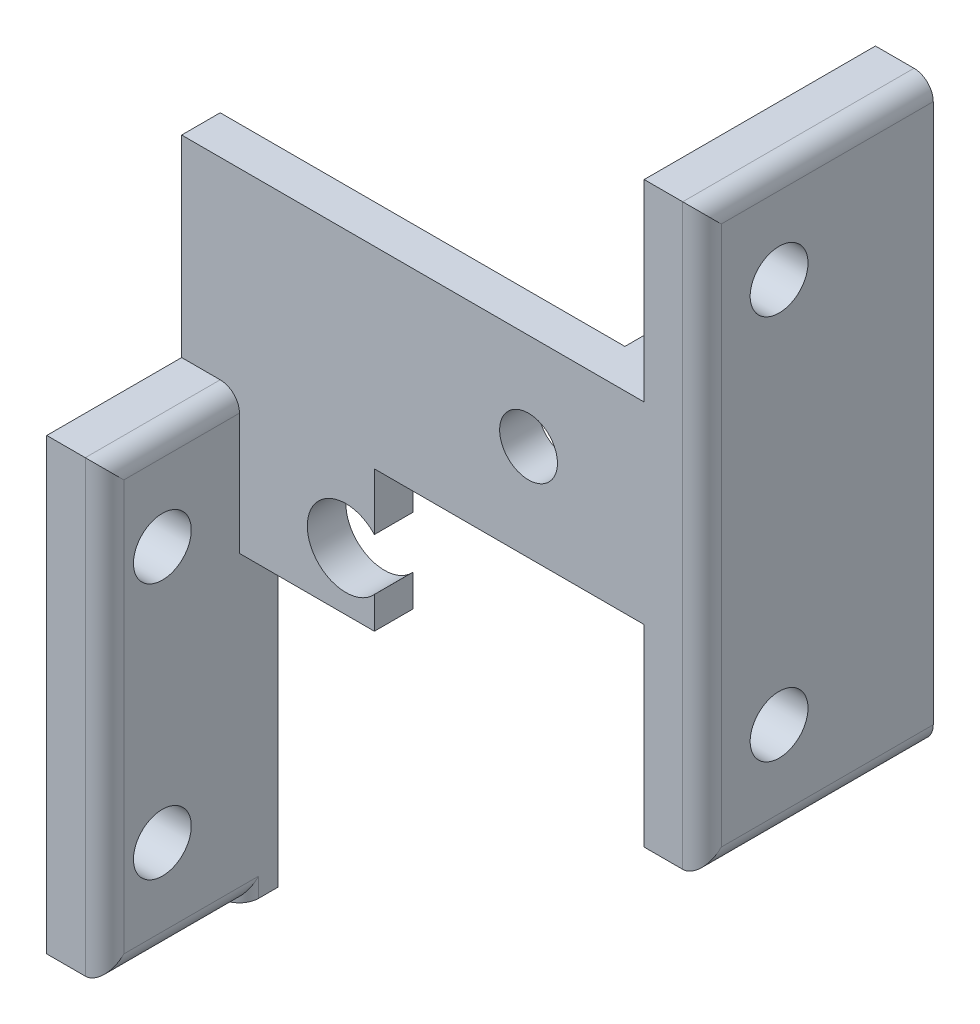
ISO-10303-21;
HEADER;
FILE_DESCRIPTION(('STEP AP214'),'2;1');
FILE_NAME('part.step','',(''),(''),'','','');
FILE_SCHEMA(('AUTOMOTIVE_DESIGN { 1 0 10303 214 1 1 1 1 }'));
ENDSEC;
DATA;
#1=APPLICATION_CONTEXT('core data for automotive mechanical design processes');
#2=APPLICATION_PROTOCOL_DEFINITION('international standard','automotive_design',2000,#1);
#3=PRODUCT_CONTEXT('',#1,'mechanical');
#4=PRODUCT('Part','Part','',(#3));
#5=PRODUCT_RELATED_PRODUCT_CATEGORY('part','',(#4));
#6=PRODUCT_DEFINITION_FORMATION('','',#4);
#7=PRODUCT_DEFINITION_CONTEXT('part definition',#1,'design');
#8=PRODUCT_DEFINITION('design','',#6,#7);
#9=PRODUCT_DEFINITION_SHAPE('','',#8);
#10=(LENGTH_UNIT() NAMED_UNIT(*) SI_UNIT(.MILLI.,.METRE.));
#11=(NAMED_UNIT(*) PLANE_ANGLE_UNIT() SI_UNIT($,.RADIAN.));
#12=(NAMED_UNIT(*) SI_UNIT($,.STERADIAN.) SOLID_ANGLE_UNIT());
#13=UNCERTAINTY_MEASURE_WITH_UNIT(LENGTH_MEASURE(1.E-05),#10,'distance_accuracy_value','');
#14=(GEOMETRIC_REPRESENTATION_CONTEXT(3) GLOBAL_UNCERTAINTY_ASSIGNED_CONTEXT((#13)) GLOBAL_UNIT_ASSIGNED_CONTEXT((#10,
#11,#12)) REPRESENTATION_CONTEXT('',''));
#15=CARTESIAN_POINT('',(0.,0.,0.));
#16=DIRECTION('',(0.,0.,1.));
#17=DIRECTION('',(1.,0.,0.));
#18=AXIS2_PLACEMENT_3D('',#15,#16,#17);
#19=CARTESIAN_POINT('',(7.,0.,0.));
#20=DIRECTION('',(1.,0.,0.));
#21=DIRECTION('',(0.,0.,-1.));
#22=AXIS2_PLACEMENT_3D('',#19,#20,#21);
#23=PLANE('',#22);
#24=DIRECTION('',(0.,0.,1.));
#25=VECTOR('',#24,1.);
#26=CARTESIAN_POINT('',(7.,-12.954786262336,14.));
#27=LINE('',#26,#25);
#28=CARTESIAN_POINT('',(7.,-12.954786262336,22.));
#29=VERTEX_POINT('',#28);
#30=CARTESIAN_POINT('',(7.,-12.954786262336,24.));
#31=VERTEX_POINT('',#30);
#32=EDGE_CURVE('E450',#29,#31,#27,.T.);
#33=ORIENTED_EDGE('',*,*,#32,.F.);
#34=DIRECTION('',(0.,1.,0.));
#35=VECTOR('',#34,1.);
#36=CARTESIAN_POINT('',(7.,-33.3,22.));
#37=LINE('',#36,#35);
#38=CARTESIAN_POINT('',(7.,-10.,22.));
#39=VERTEX_POINT('',#38);
#40=EDGE_CURVE('E340',#29,#39,#37,.T.);
#41=ORIENTED_EDGE('',*,*,#40,.T.);
#42=DIRECTION('',(0.,0.,-1.));
#43=VECTOR('',#42,1.);
#44=CARTESIAN_POINT('',(7.,-10.,0.));
#45=LINE('',#44,#43);
#46=CARTESIAN_POINT('',(7.,-10.,24.));
#47=VERTEX_POINT('',#46);
#48=EDGE_CURVE('E345',#47,#39,#45,.T.);
#49=ORIENTED_EDGE('',*,*,#48,.F.);
#50=DIRECTION('',(0.,-1.,0.));
#51=VECTOR('',#50,1.);
#52=CARTESIAN_POINT('',(7.,0.,24.));
#53=LINE('',#52,#51);
#54=EDGE_CURVE('E249',#47,#31,#53,.T.);
#55=ORIENTED_EDGE('',*,*,#54,.T.);
#56=EDGE_LOOP('',(#33,#41,#49,#55));
#57=FACE_BOUND('',#56,.T.);
#58=ADVANCED_FACE('F35',(#57),#23,.T.);
#59=DIRECTION('',(0.,0.,1.));
#60=VECTOR('',#59,1.);
#61=CARTESIAN_POINT('',(7.,-15.645213737664,14.));
#62=LINE('',#61,#60);
#63=CARTESIAN_POINT('',(7.,-15.645213737664,24.));
#64=VERTEX_POINT('',#63);
#65=CARTESIAN_POINT('',(7.,-15.645213737664,22.));
#66=VERTEX_POINT('',#65);
#67=EDGE_CURVE('E57',#64,#66,#62,.F.);
#68=ORIENTED_EDGE('',*,*,#67,.F.);
#69=CARTESIAN_POINT('',(7.,-17.3,24.));
#70=VERTEX_POINT('',#69);
#71=EDGE_CURVE('E243',#64,#70,#53,.T.);
#72=ORIENTED_EDGE('',*,*,#71,.T.);
#73=DIRECTION('',(0.,0.,1.));
#74=VECTOR('',#73,1.);
#75=CARTESIAN_POINT('',(7.,-17.3,22.));
#76=LINE('',#75,#74);
#77=CARTESIAN_POINT('',(7.,-17.3,22.));
#78=VERTEX_POINT('',#77);
#79=EDGE_CURVE('E267',#78,#70,#76,.T.);
#80=ORIENTED_EDGE('',*,*,#79,.F.);
#81=EDGE_CURVE('E244',#78,#66,#37,.T.);
#82=ORIENTED_EDGE('',*,*,#81,.T.);
#83=EDGE_LOOP('',(#68,#72,#80,#82));
#84=FACE_BOUND('',#83,.T.);
#85=ADVANCED_FACE('F265',(#84),#23,.T.);
#86=CARTESIAN_POINT('',(7.,0.,24.));
#87=DIRECTION('',(0.,0.,-1.));
#88=DIRECTION('',(0.,1.,0.));
#89=AXIS2_PLACEMENT_3D('',#86,#87,#88);
#90=PLANE('',#89);
#91=ORIENTED_EDGE('',*,*,#71,.F.);
#92=CARTESIAN_POINT('',(5.52,-14.3,24.));
#93=DIRECTION('',(0.,0.,1.));
#94=DIRECTION('',(1.,0.,0.));
#95=AXIS2_PLACEMENT_3D('',#92,#93,#94);
#96=CIRCLE('',#95,2.);
#97=EDGE_CURVE('E196',#31,#64,#96,.T.);
#98=ORIENTED_EDGE('',*,*,#97,.F.);
#99=ORIENTED_EDGE('',*,*,#54,.F.);
#100=DIRECTION('',(1.,0.,0.));
#101=VECTOR('',#100,1.);
#102=CARTESIAN_POINT('',(0.,-10.,24.));
#103=LINE('',#102,#101);
#104=CARTESIAN_POINT('',(21.,-10.,24.));
#105=VERTEX_POINT('',#104);
#106=EDGE_CURVE('E234',#47,#105,#103,.T.);
#107=ORIENTED_EDGE('',*,*,#106,.T.);
#108=DIRECTION('',(0.,-1.,0.));
#109=VECTOR('',#108,1.);
#110=CARTESIAN_POINT('',(21.,0.,24.));
#111=LINE('',#110,#109);
#112=CARTESIAN_POINT('',(21.,-20.,24.));
#113=VERTEX_POINT('',#112);
#114=EDGE_CURVE('E402',#105,#113,#111,.T.);
#115=ORIENTED_EDGE('',*,*,#114,.T.);
#116=DIRECTION('',(-1.,0.,0.));
#117=VECTOR('',#116,1.);
#118=CARTESIAN_POINT('',(24.,-20.,24.));
#119=LINE('',#118,#117);
#120=CARTESIAN_POINT('',(23.,-20.,24.));
#121=VERTEX_POINT('',#120);
#122=EDGE_CURVE('E421',#121,#113,#119,.T.);
#123=ORIENTED_EDGE('',*,*,#122,.F.);
#124=DIRECTION('',(0.,-1.,0.));
#125=VECTOR('',#124,1.);
#126=CARTESIAN_POINT('',(23.,10.,24.));
#127=LINE('',#126,#125);
#128=CARTESIAN_POINT('',(23.,10.,24.));
#129=VERTEX_POINT('',#128);
#130=EDGE_CURVE('E317',#121,#129,#127,.F.);
#131=ORIENTED_EDGE('',*,*,#130,.T.);
#132=DIRECTION('',(-1.,0.,0.));
#133=VECTOR('',#132,1.);
#134=CARTESIAN_POINT('',(24.,10.,24.));
#135=LINE('',#134,#133);
#136=CARTESIAN_POINT('',(21.,10.,24.));
#137=VERTEX_POINT('',#136);
#138=EDGE_CURVE('E397',#129,#137,#135,.T.);
#139=ORIENTED_EDGE('',*,*,#138,.T.);
#140=CARTESIAN_POINT('',(21.,0.,24.));
#141=VERTEX_POINT('',#140);
#142=EDGE_CURVE('E395',#137,#141,#111,.T.);
#143=ORIENTED_EDGE('',*,*,#142,.T.);
#144=DIRECTION('',(-1.,0.,0.));
#145=VECTOR('',#144,1.);
#146=CARTESIAN_POINT('',(7.,0.,24.));
#147=LINE('',#146,#145);
#148=CARTESIAN_POINT('',(-3.,0.,24.));
#149=VERTEX_POINT('',#148);
#150=EDGE_CURVE('E251',#141,#149,#147,.T.);
#151=ORIENTED_EDGE('',*,*,#150,.T.);
#152=DIRECTION('',(0.,1.,0.));
#153=VECTOR('',#152,1.);
#154=CARTESIAN_POINT('',(-3.,0.,24.));
#155=LINE('',#154,#153);
#156=CARTESIAN_POINT('',(-3.,-10.,24.));
#157=VERTEX_POINT('',#156);
#158=EDGE_CURVE('E393',#157,#149,#155,.T.);
#159=ORIENTED_EDGE('',*,*,#158,.F.);
#160=DIRECTION('',(1.,0.,0.));
#161=VECTOR('',#160,1.);
#162=CARTESIAN_POINT('',(-3.,-10.,24.));
#163=LINE('',#162,#161);
#164=CARTESIAN_POINT('',(-1.,-10.,24.));
#165=VERTEX_POINT('',#164);
#166=EDGE_CURVE('E277',#157,#165,#163,.T.);
#167=ORIENTED_EDGE('',*,*,#166,.T.);
#168=CARTESIAN_POINT('',(-1.,-11.,24.));
#169=DIRECTION('',(0.,0.,-1.));
#170=DIRECTION('',(0.,1.,0.));
#171=AXIS2_PLACEMENT_3D('',#168,#169,#170);
#172=CIRCLE('',#171,1.);
#173=CARTESIAN_POINT('',(0.,-11.,24.));
#174=VERTEX_POINT('',#173);
#175=EDGE_CURVE('E292',#165,#174,#172,.T.);
#176=ORIENTED_EDGE('',*,*,#175,.T.);
#177=DIRECTION('',(0.,-1.,0.));
#178=VECTOR('',#177,1.);
#179=CARTESIAN_POINT('',(0.,0.,24.));
#180=LINE('',#179,#178);
#181=CARTESIAN_POINT('',(0.,-17.3,24.));
#182=VERTEX_POINT('',#181);
#183=EDGE_CURVE('E240',#174,#182,#180,.T.);
#184=ORIENTED_EDGE('',*,*,#183,.T.);
#185=DIRECTION('',(-1.,0.,0.));
#186=VECTOR('',#185,1.);
#187=CARTESIAN_POINT('',(7.,-17.3,24.));
#188=LINE('',#187,#186);
#189=EDGE_CURVE('E273',#70,#182,#188,.T.);
#190=ORIENTED_EDGE('',*,*,#189,.F.);
#191=EDGE_LOOP('',(#91,#98,#99,#107,#115,#123,#131,#139,#143,#151,#159,#167,#176,#184,#190));
#192=FACE_BOUND('',#191,.T.);
#193=CARTESIAN_POINT('',(15.,-5.,24.));
#194=DIRECTION('',(0.,0.,1.));
#195=DIRECTION('',(1.,0.,0.));
#196=AXIS2_PLACEMENT_3D('',#193,#194,#195);
#197=CIRCLE('',#196,1.5);
#198=CARTESIAN_POINT('',(16.5,-5.,24.));
#199=VERTEX_POINT('',#198);
#200=EDGE_CURVE('E353',#199,#199,#197,.T.);
#201=ORIENTED_EDGE('',*,*,#200,.F.);
#202=EDGE_LOOP('',(#201));
#203=FACE_BOUND('',#202,.T.);
#204=ADVANCED_FACE('F274',(#192,#203),#90,.F.);
#205=CARTESIAN_POINT('',(7.,0.,24.));
#206=DIRECTION('',(0.,-1.,0.));
#207=DIRECTION('',(0.,0.,-1.));
#208=AXIS2_PLACEMENT_3D('',#205,#206,#207);
#209=PLANE('',#208);
#210=DIRECTION('',(0.,0.,1.));
#211=VECTOR('',#210,1.);
#212=CARTESIAN_POINT('',(21.,0.,24.));
#213=LINE('',#212,#211);
#214=CARTESIAN_POINT('',(21.,0.,12.));
#215=VERTEX_POINT('',#214);
#216=EDGE_CURVE('E231',#215,#141,#213,.T.);
#217=ORIENTED_EDGE('',*,*,#216,.F.);
#218=DIRECTION('',(-1.,0.,0.));
#219=VECTOR('',#218,1.);
#220=CARTESIAN_POINT('',(7.,0.,12.));
#221=LINE('',#220,#219);
#222=CARTESIAN_POINT('',(18.,0.,12.));
#223=VERTEX_POINT('',#222);
#224=EDGE_CURVE('E383',#215,#223,#221,.T.);
#225=ORIENTED_EDGE('',*,*,#224,.T.);
#226=DIRECTION('',(0.,0.,1.));
#227=VECTOR('',#226,1.);
#228=CARTESIAN_POINT('',(18.,0.,24.));
#229=LINE('',#228,#227);
#230=CARTESIAN_POINT('',(18.,0.,22.));
#231=VERTEX_POINT('',#230);
#232=EDGE_CURVE('E217',#223,#231,#229,.T.);
#233=ORIENTED_EDGE('',*,*,#232,.T.);
#234=DIRECTION('',(1.,0.,0.));
#235=VECTOR('',#234,1.);
#236=CARTESIAN_POINT('',(7.,0.,22.));
#237=LINE('',#236,#235);
#238=CARTESIAN_POINT('',(-3.,0.,22.));
#239=VERTEX_POINT('',#238);
#240=EDGE_CURVE('E341',#239,#231,#237,.T.);
#241=ORIENTED_EDGE('',*,*,#240,.F.);
#242=DIRECTION('',(0.,0.,1.));
#243=VECTOR('',#242,1.);
#244=CARTESIAN_POINT('',(-3.,0.,0.));
#245=LINE('',#244,#243);
#246=EDGE_CURVE('E372',#239,#149,#245,.T.);
#247=ORIENTED_EDGE('',*,*,#246,.T.);
#248=ORIENTED_EDGE('',*,*,#150,.F.);
#249=EDGE_LOOP('',(#217,#225,#233,#241,#247,#248));
#250=FACE_BOUND('',#249,.T.);
#251=ADVANCED_FACE('F382',(#250),#209,.F.);
#252=CARTESIAN_POINT('',(7.,-33.3,22.));
#253=DIRECTION('',(0.,0.,1.));
#254=DIRECTION('',(1.,0.,0.));
#255=AXIS2_PLACEMENT_3D('',#252,#253,#254);
#256=PLANE('',#255);
#257=DIRECTION('',(0.,1.,0.));
#258=VECTOR('',#257,1.);
#259=CARTESIAN_POINT('',(0.,0.,22.));
#260=LINE('',#259,#258);
#261=CARTESIAN_POINT('',(0.,-33.3,22.));
#262=VERTEX_POINT('',#261);
#263=CARTESIAN_POINT('',(0.,-17.3,22.));
#264=VERTEX_POINT('',#263);
#265=EDGE_CURVE('E203',#262,#264,#260,.T.);
#266=ORIENTED_EDGE('',*,*,#265,.F.);
#267=DIRECTION('',(-1.,0.,0.));
#268=VECTOR('',#267,1.);
#269=CARTESIAN_POINT('',(7.,-33.3,22.));
#270=LINE('',#269,#268);
#271=CARTESIAN_POINT('',(-3.,-33.3,22.));
#272=VERTEX_POINT('',#271);
#273=EDGE_CURVE('E187',#262,#272,#270,.T.);
#274=ORIENTED_EDGE('',*,*,#273,.T.);
#275=DIRECTION('',(0.,-1.,0.));
#276=VECTOR('',#275,1.);
#277=CARTESIAN_POINT('',(-3.,0.,22.));
#278=LINE('',#277,#276);
#279=EDGE_CURVE('E214',#239,#272,#278,.T.);
#280=ORIENTED_EDGE('',*,*,#279,.F.);
#281=ORIENTED_EDGE('',*,*,#240,.T.);
#282=DIRECTION('',(0.,1.,0.));
#283=VECTOR('',#282,1.);
#284=CARTESIAN_POINT('',(18.,0.,22.));
#285=LINE('',#284,#283);
#286=CARTESIAN_POINT('',(18.,-10.,22.));
#287=VERTEX_POINT('',#286);
#288=EDGE_CURVE('E348',#287,#231,#285,.T.);
#289=ORIENTED_EDGE('',*,*,#288,.F.);
#290=DIRECTION('',(1.,0.,0.));
#291=VECTOR('',#290,1.);
#292=CARTESIAN_POINT('',(0.,-10.,22.));
#293=LINE('',#292,#291);
#294=EDGE_CURVE('E236',#39,#287,#293,.T.);
#295=ORIENTED_EDGE('',*,*,#294,.F.);
#296=ORIENTED_EDGE('',*,*,#40,.F.);
#297=CARTESIAN_POINT('',(5.52,-14.3,22.));
#298=DIRECTION('',(0.,0.,1.));
#299=DIRECTION('',(1.,0.,0.));
#300=AXIS2_PLACEMENT_3D('',#297,#298,#299);
#301=CIRCLE('',#300,2.);
#302=EDGE_CURVE('E43',#29,#66,#301,.T.);
#303=ORIENTED_EDGE('',*,*,#302,.T.);
#304=ORIENTED_EDGE('',*,*,#81,.F.);
#305=DIRECTION('',(-1.,0.,0.));
#306=VECTOR('',#305,1.);
#307=CARTESIAN_POINT('',(7.,-17.3,22.));
#308=LINE('',#307,#306);
#309=EDGE_CURVE('E212',#78,#264,#308,.T.);
#310=ORIENTED_EDGE('',*,*,#309,.T.);
#311=EDGE_LOOP('',(#266,#274,#280,#281,#289,#295,#296,#303,#304,#310));
#312=FACE_BOUND('',#311,.T.);
#313=CARTESIAN_POINT('',(15.,-5.,22.));
#314=DIRECTION('',(0.,0.,1.));
#315=DIRECTION('',(1.,0.,0.));
#316=AXIS2_PLACEMENT_3D('',#313,#314,#315);
#317=CIRCLE('',#316,1.5);
#318=CARTESIAN_POINT('',(16.5,-5.,22.));
#319=VERTEX_POINT('',#318);
#320=EDGE_CURVE('E237',#319,#319,#317,.T.);
#321=ORIENTED_EDGE('',*,*,#320,.T.);
#322=EDGE_LOOP('',(#321));
#323=FACE_BOUND('',#322,.T.);
#324=ADVANCED_FACE('F209',(#312,#323),#256,.F.);
#325=CARTESIAN_POINT('',(0.,-10.,22.));
#326=DIRECTION('',(0.,-1.,0.));
#327=DIRECTION('',(0.,0.,-1.));
#328=AXIS2_PLACEMENT_3D('',#325,#326,#327);
#329=PLANE('',#328);
#330=DIRECTION('',(-1.,0.,0.));
#331=VECTOR('',#330,1.);
#332=CARTESIAN_POINT('',(0.,-10.,12.));
#333=LINE('',#332,#331);
#334=CARTESIAN_POINT('',(21.,-10.,12.));
#335=VERTEX_POINT('',#334);
#336=CARTESIAN_POINT('',(18.,-10.,12.));
#337=VERTEX_POINT('',#336);
#338=EDGE_CURVE('E457',#335,#337,#333,.T.);
#339=ORIENTED_EDGE('',*,*,#338,.F.);
#340=DIRECTION('',(0.,0.,-1.));
#341=VECTOR('',#340,1.);
#342=CARTESIAN_POINT('',(21.,-10.,24.));
#343=LINE('',#342,#341);
#344=EDGE_CURVE('E227',#105,#335,#343,.T.);
#345=ORIENTED_EDGE('',*,*,#344,.F.);
#346=ORIENTED_EDGE('',*,*,#106,.F.);
#347=ORIENTED_EDGE('',*,*,#48,.T.);
#348=ORIENTED_EDGE('',*,*,#294,.T.);
#349=DIRECTION('',(0.,0.,-1.));
#350=VECTOR('',#349,1.);
#351=CARTESIAN_POINT('',(18.,-10.,24.));
#352=LINE('',#351,#350);
#353=EDGE_CURVE('E213',#287,#337,#352,.T.);
#354=ORIENTED_EDGE('',*,*,#353,.T.);
#355=EDGE_LOOP('',(#339,#345,#346,#347,#348,#354));
#356=FACE_BOUND('',#355,.T.);
#357=ADVANCED_FACE('F484',(#356),#329,.T.);
#358=CARTESIAN_POINT('',(15.,-5.,22.));
#359=DIRECTION('',(0.,0.,1.));
#360=DIRECTION('',(1.,0.,0.));
#361=AXIS2_PLACEMENT_3D('',#358,#359,#360);
#362=CYLINDRICAL_SURFACE('',#361,1.5);
#363=ORIENTED_EDGE('',*,*,#320,.F.);
#364=EDGE_LOOP('',(#363));
#365=FACE_BOUND('',#364,.T.);
#366=ORIENTED_EDGE('',*,*,#200,.T.);
#367=EDGE_LOOP('',(#366));
#368=FACE_BOUND('',#367,.T.);
#369=ADVANCED_FACE('F657',(#365,#368),#362,.F.);
#370=CARTESIAN_POINT('',(0.,0.,0.));
#371=DIRECTION('',(-1.,0.,0.));
#372=DIRECTION('',(0.,0.,1.));
#373=AXIS2_PLACEMENT_3D('',#370,#371,#372);
#374=PLANE('',#373);
#375=DIRECTION('',(0.,-1.,0.));
#376=VECTOR('',#375,1.);
#377=CARTESIAN_POINT('',(0.,-44.3,23.));
#378=LINE('',#377,#376);
#379=CARTESIAN_POINT('',(0.,-32.3,23.));
#380=VERTEX_POINT('',#379);
#381=CARTESIAN_POINT('',(0.,-33.3,23.));
#382=VERTEX_POINT('',#381);
#383=EDGE_CURVE('E206',#380,#382,#378,.T.);
#384=ORIENTED_EDGE('',*,*,#383,.T.);
#385=DIRECTION('',(0.,0.,1.));
#386=VECTOR('',#385,1.);
#387=CARTESIAN_POINT('',(0.,-33.3,24.));
#388=LINE('',#387,#386);
#389=EDGE_CURVE('E49',#262,#382,#388,.T.);
#390=ORIENTED_EDGE('',*,*,#389,.F.);
#391=ORIENTED_EDGE('',*,*,#265,.T.);
#392=DIRECTION('',(0.,0.,1.));
#393=VECTOR('',#392,1.);
#394=CARTESIAN_POINT('',(0.,-17.3,22.));
#395=LINE('',#394,#393);
#396=EDGE_CURVE('E219',#264,#182,#395,.T.);
#397=ORIENTED_EDGE('',*,*,#396,.T.);
#398=ORIENTED_EDGE('',*,*,#183,.F.);
#399=DIRECTION('',(0.,0.,-1.));
#400=VECTOR('',#399,1.);
#401=CARTESIAN_POINT('',(0.,-11.,0.));
#402=LINE('',#401,#400);
#403=CARTESIAN_POINT('',(0.,-11.,30.));
#404=VERTEX_POINT('',#403);
#405=EDGE_CURVE('E286',#174,#404,#402,.F.);
#406=ORIENTED_EDGE('',*,*,#405,.T.);
#407=DIRECTION('',(0.,-1.,0.));
#408=VECTOR('',#407,1.);
#409=CARTESIAN_POINT('',(0.,-33.3,30.));
#410=LINE('',#409,#408);
#411=CARTESIAN_POINT('',(0.,-32.3,30.));
#412=VERTEX_POINT('',#411);
#413=EDGE_CURVE('E245',#404,#412,#410,.T.);
#414=ORIENTED_EDGE('',*,*,#413,.T.);
#415=DIRECTION('',(0.,0.,1.));
#416=VECTOR('',#415,1.);
#417=CARTESIAN_POINT('',(0.,-32.3,0.));
#418=LINE('',#417,#416);
#419=EDGE_CURVE('E256',#412,#380,#418,.F.);
#420=ORIENTED_EDGE('',*,*,#419,.T.);
#421=EDGE_LOOP('',(#384,#390,#391,#397,#398,#406,#414,#420));
#422=FACE_BOUND('',#421,.T.);
#423=CARTESIAN_POINT('',(0.,-15.,28.));
#424=DIRECTION('',(-1.,0.,0.));
#425=DIRECTION('',(0.,0.,1.));
#426=AXIS2_PLACEMENT_3D('',#423,#424,#425);
#427=CIRCLE('',#426,1.5);
#428=CARTESIAN_POINT('',(0.,-15.,29.5));
#429=VERTEX_POINT('',#428);
#430=EDGE_CURVE('E337',#429,#429,#427,.T.);
#431=ORIENTED_EDGE('',*,*,#430,.T.);
#432=EDGE_LOOP('',(#431));
#433=FACE_BOUND('',#432,.T.);
#434=CARTESIAN_POINT('',(0.,-28.3,28.));
#435=DIRECTION('',(-1.,0.,0.));
#436=DIRECTION('',(0.,0.,1.));
#437=AXIS2_PLACEMENT_3D('',#434,#435,#436);
#438=CIRCLE('',#437,1.5);
#439=CARTESIAN_POINT('',(0.,-28.3,29.5));
#440=VERTEX_POINT('',#439);
#441=EDGE_CURVE('E362',#440,#440,#438,.T.);
#442=ORIENTED_EDGE('',*,*,#441,.T.);
#443=EDGE_LOOP('',(#442));
#444=FACE_BOUND('',#443,.T.);
#445=ADVANCED_FACE('F200',(#422,#433,#444),#374,.F.);
#446=CARTESIAN_POINT('',(-3.,-33.3,0.));
#447=DIRECTION('',(0.,1.,0.));
#448=DIRECTION('',(0.,0.,1.));
#449=AXIS2_PLACEMENT_3D('',#446,#447,#448);
#450=PLANE('',#449);
#451=DIRECTION('',(0.,0.,1.));
#452=VECTOR('',#451,1.);
#453=CARTESIAN_POINT('',(-3.,-33.3,0.));
#454=LINE('',#453,#452);
#455=CARTESIAN_POINT('',(-3.,-33.3,31.));
#456=VERTEX_POINT('',#455);
#457=EDGE_CURVE('E191',#272,#456,#454,.T.);
#458=ORIENTED_EDGE('',*,*,#457,.F.);
#459=ORIENTED_EDGE('',*,*,#273,.F.);
#460=ORIENTED_EDGE('',*,*,#389,.T.);
#461=CARTESIAN_POINT('',(-1.,-33.3,23.));
#462=DIRECTION('',(0.,1.,0.));
#463=DIRECTION('',(0.,0.,1.));
#464=AXIS2_PLACEMENT_3D('',#461,#462,#463);
#465=CIRCLE('',#464,1.);
#466=CARTESIAN_POINT('',(-1.,-33.3,24.));
#467=VERTEX_POINT('',#466);
#468=EDGE_CURVE('E11',#382,#467,#465,.F.);
#469=ORIENTED_EDGE('',*,*,#468,.T.);
#470=DIRECTION('',(0.,0.,1.));
#471=VECTOR('',#470,1.);
#472=CARTESIAN_POINT('',(-1.,-33.3,0.));
#473=LINE('',#472,#471);
#474=CARTESIAN_POINT('',(-1.,-33.3,31.));
#475=VERTEX_POINT('',#474);
#476=EDGE_CURVE('E301',#467,#475,#473,.T.);
#477=ORIENTED_EDGE('',*,*,#476,.T.);
#478=DIRECTION('',(1.,0.,0.));
#479=VECTOR('',#478,1.);
#480=CARTESIAN_POINT('',(-3.,-33.3,31.));
#481=LINE('',#480,#479);
#482=EDGE_CURVE('E356',#456,#475,#481,.T.);
#483=ORIENTED_EDGE('',*,*,#482,.F.);
#484=EDGE_LOOP('',(#458,#459,#460,#469,#477,#483));
#485=FACE_BOUND('',#484,.T.);
#486=ADVANCED_FACE('F188',(#485),#450,.F.);
#487=CARTESIAN_POINT('',(-3.,0.,31.));
#488=DIRECTION('',(0.,0.,1.));
#489=DIRECTION('',(1.,0.,0.));
#490=AXIS2_PLACEMENT_3D('',#487,#488,#489);
#491=PLANE('',#490);
#492=ORIENTED_EDGE('',*,*,#482,.T.);
#493=DIRECTION('',(0.,-1.,0.));
#494=VECTOR('',#493,1.);
#495=CARTESIAN_POINT('',(-1.,-10.,31.));
#496=LINE('',#495,#494);
#497=CARTESIAN_POINT('',(-1.,-10.,31.));
#498=VERTEX_POINT('',#497);
#499=EDGE_CURVE('E303',#475,#498,#496,.F.);
#500=ORIENTED_EDGE('',*,*,#499,.T.);
#501=DIRECTION('',(1.,0.,0.));
#502=VECTOR('',#501,1.);
#503=CARTESIAN_POINT('',(-3.,-10.,31.));
#504=LINE('',#503,#502);
#505=CARTESIAN_POINT('',(-3.,-10.,31.));
#506=VERTEX_POINT('',#505);
#507=EDGE_CURVE('E281',#506,#498,#504,.T.);
#508=ORIENTED_EDGE('',*,*,#507,.F.);
#509=DIRECTION('',(0.,-1.,0.));
#510=VECTOR('',#509,1.);
#511=CARTESIAN_POINT('',(-3.,0.,31.));
#512=LINE('',#511,#510);
#513=EDGE_CURVE('E375',#506,#456,#512,.T.);
#514=ORIENTED_EDGE('',*,*,#513,.T.);
#515=EDGE_LOOP('',(#492,#500,#508,#514));
#516=FACE_BOUND('',#515,.T.);
#517=ADVANCED_FACE('F637',(#516),#491,.T.);
#518=CARTESIAN_POINT('',(-3.,-28.3,28.));
#519=DIRECTION('',(1.,0.,0.));
#520=DIRECTION('',(0.,0.,-1.));
#521=AXIS2_PLACEMENT_3D('',#518,#519,#520);
#522=CYLINDRICAL_SURFACE('',#521,1.5);
#523=CARTESIAN_POINT('',(-3.,-28.3,28.));
#524=DIRECTION('',(-1.,0.,0.));
#525=DIRECTION('',(0.,0.,1.));
#526=AXIS2_PLACEMENT_3D('',#523,#524,#525);
#527=CIRCLE('',#526,1.5);
#528=CARTESIAN_POINT('',(-3.,-28.3,29.5));
#529=VERTEX_POINT('',#528);
#530=EDGE_CURVE('E361',#529,#529,#527,.T.);
#531=ORIENTED_EDGE('',*,*,#530,.T.);
#532=EDGE_LOOP('',(#531));
#533=FACE_BOUND('',#532,.T.);
#534=ORIENTED_EDGE('',*,*,#441,.F.);
#535=EDGE_LOOP('',(#534));
#536=FACE_BOUND('',#535,.T.);
#537=ADVANCED_FACE('F629',(#533,#536),#522,.F.);
#538=CARTESIAN_POINT('',(-3.,-15.,28.));
#539=DIRECTION('',(1.,0.,0.));
#540=DIRECTION('',(0.,0.,-1.));
#541=AXIS2_PLACEMENT_3D('',#538,#539,#540);
#542=CYLINDRICAL_SURFACE('',#541,1.5);
#543=CARTESIAN_POINT('',(-3.,-15.,28.));
#544=DIRECTION('',(-1.,0.,0.));
#545=DIRECTION('',(0.,0.,1.));
#546=AXIS2_PLACEMENT_3D('',#543,#544,#545);
#547=CIRCLE('',#546,1.5);
#548=CARTESIAN_POINT('',(-3.,-15.,29.5));
#549=VERTEX_POINT('',#548);
#550=EDGE_CURVE('E369',#549,#549,#547,.T.);
#551=ORIENTED_EDGE('',*,*,#550,.T.);
#552=EDGE_LOOP('',(#551));
#553=FACE_BOUND('',#552,.T.);
#554=ORIENTED_EDGE('',*,*,#430,.F.);
#555=EDGE_LOOP('',(#554));
#556=FACE_BOUND('',#555,.T.);
#557=ADVANCED_FACE('F622',(#553,#556),#542,.F.);
#558=CARTESIAN_POINT('',(-3.,0.,0.));
#559=DIRECTION('',(-1.,0.,0.));
#560=DIRECTION('',(0.,0.,1.));
#561=AXIS2_PLACEMENT_3D('',#558,#559,#560);
#562=PLANE('',#561);
#563=ORIENTED_EDGE('',*,*,#279,.T.);
#564=ORIENTED_EDGE('',*,*,#457,.T.);
#565=ORIENTED_EDGE('',*,*,#513,.F.);
#566=DIRECTION('',(0.,0.,-1.));
#567=VECTOR('',#566,1.);
#568=CARTESIAN_POINT('',(-3.,-10.,31.));
#569=LINE('',#568,#567);
#570=EDGE_CURVE('E425',#506,#157,#569,.T.);
#571=ORIENTED_EDGE('',*,*,#570,.T.);
#572=ORIENTED_EDGE('',*,*,#158,.T.);
#573=ORIENTED_EDGE('',*,*,#246,.F.);
#574=EDGE_LOOP('',(#563,#564,#565,#571,#572,#573));
#575=FACE_BOUND('',#574,.T.);
#576=ORIENTED_EDGE('',*,*,#550,.F.);
#577=EDGE_LOOP('',(#576));
#578=FACE_BOUND('',#577,.T.);
#579=ORIENTED_EDGE('',*,*,#530,.F.);
#580=EDGE_LOOP('',(#579));
#581=FACE_BOUND('',#580,.T.);
#582=ADVANCED_FACE('F390',(#575,#578,#581),#562,.T.);
#583=CARTESIAN_POINT('',(18.,0.,0.));
#584=DIRECTION('',(1.,0.,0.));
#585=DIRECTION('',(0.,0.,-1.));
#586=AXIS2_PLACEMENT_3D('',#583,#584,#585);
#587=PLANE('',#586);
#588=ORIENTED_EDGE('',*,*,#232,.F.);
#589=DIRECTION('',(0.,-1.,0.));
#590=VECTOR('',#589,1.);
#591=CARTESIAN_POINT('',(18.,0.,12.));
#592=LINE('',#591,#590);
#593=EDGE_CURVE('E455',#223,#337,#592,.T.);
#594=ORIENTED_EDGE('',*,*,#593,.T.);
#595=ORIENTED_EDGE('',*,*,#353,.F.);
#596=ORIENTED_EDGE('',*,*,#288,.T.);
#597=EDGE_LOOP('',(#588,#594,#595,#596));
#598=FACE_BOUND('',#597,.T.);
#599=ADVANCED_FACE('F387',(#598),#587,.F.);
#600=CARTESIAN_POINT('',(7.,-17.3,22.));
#601=DIRECTION('',(0.,1.,0.));
#602=DIRECTION('',(0.,0.,1.));
#603=AXIS2_PLACEMENT_3D('',#600,#601,#602);
#604=PLANE('',#603);
#605=ORIENTED_EDGE('',*,*,#189,.T.);
#606=ORIENTED_EDGE('',*,*,#396,.F.);
#607=ORIENTED_EDGE('',*,*,#309,.F.);
#608=ORIENTED_EDGE('',*,*,#79,.T.);
#609=EDGE_LOOP('',(#605,#606,#607,#608));
#610=FACE_BOUND('',#609,.T.);
#611=ADVANCED_FACE('F272',(#610),#604,.F.);
#612=CARTESIAN_POINT('',(-3.,-10.,31.));
#613=DIRECTION('',(0.,-1.,0.));
#614=DIRECTION('',(0.,0.,-1.));
#615=AXIS2_PLACEMENT_3D('',#612,#613,#614);
#616=PLANE('',#615);
#617=ORIENTED_EDGE('',*,*,#507,.T.);
#618=DIRECTION('',(0.,0.,-1.));
#619=VECTOR('',#618,1.);
#620=CARTESIAN_POINT('',(-1.,-10.,31.));
#621=LINE('',#620,#619);
#622=EDGE_CURVE('E297',#498,#165,#621,.T.);
#623=ORIENTED_EDGE('',*,*,#622,.T.);
#624=ORIENTED_EDGE('',*,*,#166,.F.);
#625=ORIENTED_EDGE('',*,*,#570,.F.);
#626=EDGE_LOOP('',(#617,#623,#624,#625));
#627=FACE_BOUND('',#626,.T.);
#628=ADVANCED_FACE('F598',(#627),#616,.F.);
#629=CARTESIAN_POINT('',(21.,0.,0.));
#630=DIRECTION('',(1.,0.,0.));
#631=DIRECTION('',(0.,0.,-1.));
#632=AXIS2_PLACEMENT_3D('',#629,#630,#631);
#633=PLANE('',#632);
#634=CARTESIAN_POINT('',(21.,-15.,20.));
#635=DIRECTION('',(1.,0.,0.));
#636=DIRECTION('',(0.,0.,-1.));
#637=AXIS2_PLACEMENT_3D('',#634,#635,#636);
#638=CIRCLE('',#637,1.5);
#639=CARTESIAN_POINT('',(21.,-15.,18.5));
#640=VERTEX_POINT('',#639);
#641=EDGE_CURVE('E329',#640,#640,#638,.T.);
#642=ORIENTED_EDGE('',*,*,#641,.T.);
#643=EDGE_LOOP('',(#642));
#644=FACE_BOUND('',#643,.T.);
#645=ORIENTED_EDGE('',*,*,#344,.T.);
#646=DIRECTION('',(0.,-1.,0.));
#647=VECTOR('',#646,1.);
#648=CARTESIAN_POINT('',(21.,0.,12.));
#649=LINE('',#648,#647);
#650=CARTESIAN_POINT('',(21.,-20.,12.));
#651=VERTEX_POINT('',#650);
#652=EDGE_CURVE('E459',#335,#651,#649,.T.);
#653=ORIENTED_EDGE('',*,*,#652,.T.);
#654=DIRECTION('',(0.,0.,-1.));
#655=VECTOR('',#654,1.);
#656=CARTESIAN_POINT('',(21.,-20.,0.));
#657=LINE('',#656,#655);
#658=EDGE_CURVE('E401',#113,#651,#657,.T.);
#659=ORIENTED_EDGE('',*,*,#658,.F.);
#660=ORIENTED_EDGE('',*,*,#114,.F.);
#661=EDGE_LOOP('',(#645,#653,#659,#660));
#662=FACE_BOUND('',#661,.T.);
#663=ADVANCED_FACE('F481',(#644,#662),#633,.F.);
#664=CARTESIAN_POINT('',(21.,5.,20.));
#665=DIRECTION('',(1.,0.,0.));
#666=DIRECTION('',(0.,0.,-1.));
#667=AXIS2_PLACEMENT_3D('',#664,#665,#666);
#668=CIRCLE('',#667,1.5);
#669=CARTESIAN_POINT('',(21.,5.,18.5));
#670=VERTEX_POINT('',#669);
#671=EDGE_CURVE('E405',#670,#670,#668,.T.);
#672=ORIENTED_EDGE('',*,*,#671,.T.);
#673=EDGE_LOOP('',(#672));
#674=FACE_BOUND('',#673,.T.);
#675=DIRECTION('',(0.,0.,-1.));
#676=VECTOR('',#675,1.);
#677=CARTESIAN_POINT('',(21.,10.,0.));
#678=LINE('',#677,#676);
#679=CARTESIAN_POINT('',(21.,10.,12.));
#680=VERTEX_POINT('',#679);
#681=EDGE_CURVE('E408',#137,#680,#678,.T.);
#682=ORIENTED_EDGE('',*,*,#681,.T.);
#683=DIRECTION('',(0.,-1.,0.));
#684=VECTOR('',#683,1.);
#685=CARTESIAN_POINT('',(21.,0.,12.));
#686=LINE('',#685,#684);
#687=EDGE_CURVE('E438',#680,#215,#686,.T.);
#688=ORIENTED_EDGE('',*,*,#687,.T.);
#689=ORIENTED_EDGE('',*,*,#216,.T.);
#690=ORIENTED_EDGE('',*,*,#142,.F.);
#691=EDGE_LOOP('',(#682,#688,#689,#690));
#692=FACE_BOUND('',#691,.T.);
#693=ADVANCED_FACE('F437',(#674,#692),#633,.F.);
#694=CARTESIAN_POINT('',(24.,10.,0.));
#695=DIRECTION('',(0.,1.,0.));
#696=DIRECTION('',(0.,0.,1.));
#697=AXIS2_PLACEMENT_3D('',#694,#695,#696);
#698=PLANE('',#697);
#699=DIRECTION('',(1.,0.,0.));
#700=VECTOR('',#699,1.);
#701=CARTESIAN_POINT('',(24.,10.,12.));
#702=LINE('',#701,#700);
#703=CARTESIAN_POINT('',(23.,10.,12.));
#704=VERTEX_POINT('',#703);
#705=EDGE_CURVE('E443',#680,#704,#702,.T.);
#706=ORIENTED_EDGE('',*,*,#705,.F.);
#707=ORIENTED_EDGE('',*,*,#681,.F.);
#708=ORIENTED_EDGE('',*,*,#138,.F.);
#709=DIRECTION('',(0.,0.,-1.));
#710=VECTOR('',#709,1.);
#711=CARTESIAN_POINT('',(23.,10.,0.));
#712=LINE('',#711,#710);
#713=EDGE_CURVE('E305',#129,#704,#712,.T.);
#714=ORIENTED_EDGE('',*,*,#713,.T.);
#715=EDGE_LOOP('',(#706,#707,#708,#714));
#716=FACE_BOUND('',#715,.T.);
#717=ADVANCED_FACE('F441',(#716),#698,.T.);
#718=CARTESIAN_POINT('',(24.,-20.,0.));
#719=DIRECTION('',(0.,1.,0.));
#720=DIRECTION('',(0.,0.,1.));
#721=AXIS2_PLACEMENT_3D('',#718,#719,#720);
#722=PLANE('',#721);
#723=ORIENTED_EDGE('',*,*,#658,.T.);
#724=DIRECTION('',(1.,0.,0.));
#725=VECTOR('',#724,1.);
#726=CARTESIAN_POINT('',(24.,-20.,12.));
#727=LINE('',#726,#725);
#728=CARTESIAN_POINT('',(23.,-20.,12.));
#729=VERTEX_POINT('',#728);
#730=EDGE_CURVE('E462',#651,#729,#727,.T.);
#731=ORIENTED_EDGE('',*,*,#730,.T.);
#732=DIRECTION('',(0.,0.,-1.));
#733=VECTOR('',#732,1.);
#734=CARTESIAN_POINT('',(23.,-20.,24.));
#735=LINE('',#734,#733);
#736=EDGE_CURVE('E315',#729,#121,#735,.F.);
#737=ORIENTED_EDGE('',*,*,#736,.T.);
#738=ORIENTED_EDGE('',*,*,#122,.T.);
#739=EDGE_LOOP('',(#723,#731,#737,#738));
#740=FACE_BOUND('',#739,.T.);
#741=ADVANCED_FACE('F470',(#740),#722,.F.);
#742=CARTESIAN_POINT('',(24.,-15.,20.));
#743=DIRECTION('',(-1.,0.,0.));
#744=DIRECTION('',(0.,0.,1.));
#745=AXIS2_PLACEMENT_3D('',#742,#743,#744);
#746=CYLINDRICAL_SURFACE('',#745,1.5);
#747=CARTESIAN_POINT('',(24.,-15.,20.));
#748=DIRECTION('',(1.,0.,0.));
#749=DIRECTION('',(0.,0.,-1.));
#750=AXIS2_PLACEMENT_3D('',#747,#748,#749);
#751=CIRCLE('',#750,1.5);
#752=CARTESIAN_POINT('',(24.,-15.,18.5));
#753=VERTEX_POINT('',#752);
#754=EDGE_CURVE('E420',#753,#753,#751,.T.);
#755=ORIENTED_EDGE('',*,*,#754,.T.);
#756=EDGE_LOOP('',(#755));
#757=FACE_BOUND('',#756,.T.);
#758=ORIENTED_EDGE('',*,*,#641,.F.);
#759=EDGE_LOOP('',(#758));
#760=FACE_BOUND('',#759,.T.);
#761=ADVANCED_FACE('F564',(#757,#760),#746,.F.);
#762=CARTESIAN_POINT('',(24.,5.,20.));
#763=DIRECTION('',(-1.,0.,0.));
#764=DIRECTION('',(0.,0.,1.));
#765=AXIS2_PLACEMENT_3D('',#762,#763,#764);
#766=CYLINDRICAL_SURFACE('',#765,1.5);
#767=CARTESIAN_POINT('',(24.,5.,20.));
#768=DIRECTION('',(1.,0.,0.));
#769=DIRECTION('',(0.,0.,-1.));
#770=AXIS2_PLACEMENT_3D('',#767,#768,#769);
#771=CIRCLE('',#770,1.5);
#772=CARTESIAN_POINT('',(24.,5.,18.5));
#773=VERTEX_POINT('',#772);
#774=EDGE_CURVE('E422',#773,#773,#771,.T.);
#775=ORIENTED_EDGE('',*,*,#774,.T.);
#776=EDGE_LOOP('',(#775));
#777=FACE_BOUND('',#776,.T.);
#778=ORIENTED_EDGE('',*,*,#671,.F.);
#779=EDGE_LOOP('',(#778));
#780=FACE_BOUND('',#779,.T.);
#781=ADVANCED_FACE('F555',(#777,#780),#766,.F.);
#782=CARTESIAN_POINT('',(24.,0.,0.));
#783=DIRECTION('',(1.,0.,0.));
#784=DIRECTION('',(0.,0.,-1.));
#785=AXIS2_PLACEMENT_3D('',#782,#783,#784);
#786=PLANE('',#785);
#787=DIRECTION('',(0.,-1.,0.));
#788=VECTOR('',#787,1.);
#789=CARTESIAN_POINT('',(24.,10.000025,12.));
#790=LINE('',#789,#788);
#791=CARTESIAN_POINT('',(24.,9.,12.));
#792=VERTEX_POINT('',#791);
#793=CARTESIAN_POINT('',(24.,-19.,12.));
#794=VERTEX_POINT('',#793);
#795=EDGE_CURVE('E447',#792,#794,#790,.T.);
#796=ORIENTED_EDGE('',*,*,#795,.F.);
#797=DIRECTION('',(0.,0.,-1.));
#798=VECTOR('',#797,1.);
#799=CARTESIAN_POINT('',(24.,9.,0.));
#800=LINE('',#799,#798);
#801=CARTESIAN_POINT('',(24.,9.,23.));
#802=VERTEX_POINT('',#801);
#803=EDGE_CURVE('E313',#792,#802,#800,.F.);
#804=ORIENTED_EDGE('',*,*,#803,.T.);
#805=DIRECTION('',(0.,-1.,0.));
#806=VECTOR('',#805,1.);
#807=CARTESIAN_POINT('',(24.,-20.,23.));
#808=LINE('',#807,#806);
#809=CARTESIAN_POINT('',(24.,-19.,23.));
#810=VERTEX_POINT('',#809);
#811=EDGE_CURVE('E308',#802,#810,#808,.T.);
#812=ORIENTED_EDGE('',*,*,#811,.T.);
#813=DIRECTION('',(0.,0.,-1.));
#814=VECTOR('',#813,1.);
#815=CARTESIAN_POINT('',(24.,-19.,0.));
#816=LINE('',#815,#814);
#817=EDGE_CURVE('E310',#810,#794,#816,.T.);
#818=ORIENTED_EDGE('',*,*,#817,.T.);
#819=EDGE_LOOP('',(#796,#804,#812,#818));
#820=FACE_BOUND('',#819,.T.);
#821=ORIENTED_EDGE('',*,*,#754,.F.);
#822=EDGE_LOOP('',(#821));
#823=FACE_BOUND('',#822,.T.);
#824=ORIENTED_EDGE('',*,*,#774,.F.);
#825=EDGE_LOOP('',(#824));
#826=FACE_BOUND('',#825,.T.);
#827=ADVANCED_FACE('F521',(#820,#823,#826),#786,.T.);
#828=CARTESIAN_POINT('',(-1.,-11.,31.));
#829=DIRECTION('',(0.,0.,-1.));
#830=DIRECTION('',(-1.,0.,0.));
#831=AXIS2_PLACEMENT_3D('',#828,#829,#830);
#832=CYLINDRICAL_SURFACE('',#831,1.);
#833=ORIENTED_EDGE('',*,*,#175,.F.);
#834=ORIENTED_EDGE('',*,*,#622,.F.);
#835=CARTESIAN_POINT('',(-1.,-11.,30.));
#836=DIRECTION('',(0.,0.707106781186547,-0.707106781186547));
#837=DIRECTION('',(0.,0.707106781186547,0.707106781186547));
#838=AXIS2_PLACEMENT_3D('',#835,#836,#837);
#839=ELLIPSE('',#838,1.41421356237309,1.);
#840=EDGE_CURVE('E294',#404,#498,#839,.F.);
#841=ORIENTED_EDGE('',*,*,#840,.F.);
#842=ORIENTED_EDGE('',*,*,#405,.F.);
#843=EDGE_LOOP('',(#833,#834,#841,#842));
#844=FACE_BOUND('',#843,.T.);
#845=ADVANCED_FACE('F290',(#844),#832,.T.);
#846=CARTESIAN_POINT('',(-1.,0.,30.));
#847=DIRECTION('',(0.,1.,0.));
#848=DIRECTION('',(0.,0.,1.));
#849=AXIS2_PLACEMENT_3D('',#846,#847,#848);
#850=CYLINDRICAL_SURFACE('',#849,1.);
#851=ORIENTED_EDGE('',*,*,#840,.T.);
#852=ORIENTED_EDGE('',*,*,#499,.F.);
#853=CARTESIAN_POINT('',(-1.,-32.3,30.));
#854=DIRECTION('',(0.,0.707106781186547,0.707106781186547));
#855=DIRECTION('',(0.,0.707106781186547,-0.707106781186547));
#856=AXIS2_PLACEMENT_3D('',#853,#854,#855);
#857=ELLIPSE('',#856,1.41421356237309,1.);
#858=EDGE_CURVE('E324',#412,#475,#857,.F.);
#859=ORIENTED_EDGE('',*,*,#858,.F.);
#860=ORIENTED_EDGE('',*,*,#413,.F.);
#861=EDGE_LOOP('',(#851,#852,#859,#860));
#862=FACE_BOUND('',#861,.T.);
#863=ADVANCED_FACE('F514',(#862),#850,.T.);
#864=CARTESIAN_POINT('',(-1.,-32.3,0.));
#865=DIRECTION('',(0.,0.,1.));
#866=DIRECTION('',(1.,0.,0.));
#867=AXIS2_PLACEMENT_3D('',#864,#865,#866);
#868=CYLINDRICAL_SURFACE('',#867,1.);
#869=ORIENTED_EDGE('',*,*,#858,.T.);
#870=ORIENTED_EDGE('',*,*,#476,.F.);
#871=CARTESIAN_POINT('',(-1.,-32.3,23.));
#872=DIRECTION('',(0.,0.707106781186548,0.707106781186547));
#873=DIRECTION('',(0.,0.707106781186547,-0.707106781186548));
#874=AXIS2_PLACEMENT_3D('',#871,#872,#873);
#875=ELLIPSE('',#874,1.4142135623731,1.);
#876=EDGE_CURVE('E321',#380,#467,#875,.F.);
#877=ORIENTED_EDGE('',*,*,#876,.F.);
#878=ORIENTED_EDGE('',*,*,#419,.F.);
#879=EDGE_LOOP('',(#869,#870,#877,#878));
#880=FACE_BOUND('',#879,.T.);
#881=ADVANCED_FACE('F510',(#880),#868,.T.);
#882=CARTESIAN_POINT('',(-1.,0.,23.));
#883=DIRECTION('',(0.,1.,0.));
#884=DIRECTION('',(0.,0.,1.));
#885=AXIS2_PLACEMENT_3D('',#882,#883,#884);
#886=CYLINDRICAL_SURFACE('',#885,1.);
#887=ORIENTED_EDGE('',*,*,#468,.F.);
#888=ORIENTED_EDGE('',*,*,#383,.F.);
#889=ORIENTED_EDGE('',*,*,#876,.T.);
#890=EDGE_LOOP('',(#887,#888,#889));
#891=FACE_BOUND('',#890,.T.);
#892=ADVANCED_FACE('F507',(#891),#886,.T.);
#893=CARTESIAN_POINT('',(23.,-19.,0.));
#894=DIRECTION('',(0.,0.,1.));
#895=DIRECTION('',(1.,0.,0.));
#896=AXIS2_PLACEMENT_3D('',#893,#894,#895);
#897=CYLINDRICAL_SURFACE('',#896,1.);
#898=CARTESIAN_POINT('',(23.,-19.,12.));
#899=DIRECTION('',(0.,0.,1.));
#900=DIRECTION('',(1.,0.,0.));
#901=AXIS2_PLACEMENT_3D('',#898,#899,#900);
#902=CIRCLE('',#901,1.);
#903=EDGE_CURVE('E333',#794,#729,#902,.F.);
#904=ORIENTED_EDGE('',*,*,#903,.F.);
#905=ORIENTED_EDGE('',*,*,#817,.F.);
#906=CARTESIAN_POINT('',(23.,-19.,23.));
#907=DIRECTION('',(0.,0.707106781186547,0.707106781186547));
#908=DIRECTION('',(0.,0.707106781186548,-0.707106781186547));
#909=AXIS2_PLACEMENT_3D('',#906,#907,#908);
#910=ELLIPSE('',#909,1.41421356237309,1.);
#911=EDGE_CURVE('E325',#121,#810,#910,.T.);
#912=ORIENTED_EDGE('',*,*,#911,.F.);
#913=ORIENTED_EDGE('',*,*,#736,.F.);
#914=EDGE_LOOP('',(#904,#905,#912,#913));
#915=FACE_BOUND('',#914,.T.);
#916=ADVANCED_FACE('F37',(#915),#897,.T.);
#917=CARTESIAN_POINT('',(23.,0.,23.));
#918=DIRECTION('',(0.,1.,0.));
#919=DIRECTION('',(0.,0.,1.));
#920=AXIS2_PLACEMENT_3D('',#917,#918,#919);
#921=CYLINDRICAL_SURFACE('',#920,1.);
#922=ORIENTED_EDGE('',*,*,#911,.T.);
#923=ORIENTED_EDGE('',*,*,#811,.F.);
#924=CARTESIAN_POINT('',(23.,9.,23.));
#925=DIRECTION('',(0.,0.707106781186548,-0.707106781186547));
#926=DIRECTION('',(0.,0.707106781186547,0.707106781186547));
#927=AXIS2_PLACEMENT_3D('',#924,#925,#926);
#928=ELLIPSE('',#927,1.4142135623731,1.);
#929=EDGE_CURVE('E330',#129,#802,#928,.T.);
#930=ORIENTED_EDGE('',*,*,#929,.F.);
#931=ORIENTED_EDGE('',*,*,#130,.F.);
#932=EDGE_LOOP('',(#922,#923,#930,#931));
#933=FACE_BOUND('',#932,.T.);
#934=ADVANCED_FACE('F476',(#933),#921,.T.);
#935=CARTESIAN_POINT('',(23.,9.,0.));
#936=DIRECTION('',(0.,0.,-1.));
#937=DIRECTION('',(-1.,0.,0.));
#938=AXIS2_PLACEMENT_3D('',#935,#936,#937);
#939=CYLINDRICAL_SURFACE('',#938,1.);
#940=CARTESIAN_POINT('',(23.,9.,12.));
#941=DIRECTION('',(0.,0.,1.));
#942=DIRECTION('',(1.,0.,0.));
#943=AXIS2_PLACEMENT_3D('',#940,#941,#942);
#944=CIRCLE('',#943,1.);
#945=EDGE_CURVE('E320',#704,#792,#944,.F.);
#946=ORIENTED_EDGE('',*,*,#945,.F.);
#947=ORIENTED_EDGE('',*,*,#713,.F.);
#948=ORIENTED_EDGE('',*,*,#929,.T.);
#949=ORIENTED_EDGE('',*,*,#803,.F.);
#950=EDGE_LOOP('',(#946,#947,#948,#949));
#951=FACE_BOUND('',#950,.T.);
#952=ADVANCED_FACE('F493',(#951),#939,.T.);
#953=CARTESIAN_POINT('',(-3.,10.000025,12.));
#954=DIRECTION('',(0.,0.,1.));
#955=DIRECTION('',(1.,0.,0.));
#956=AXIS2_PLACEMENT_3D('',#953,#954,#955);
#957=PLANE('',#956);
#958=ORIENTED_EDGE('',*,*,#903,.T.);
#959=ORIENTED_EDGE('',*,*,#730,.F.);
#960=ORIENTED_EDGE('',*,*,#652,.F.);
#961=ORIENTED_EDGE('',*,*,#338,.T.);
#962=ORIENTED_EDGE('',*,*,#593,.F.);
#963=ORIENTED_EDGE('',*,*,#224,.F.);
#964=ORIENTED_EDGE('',*,*,#687,.F.);
#965=ORIENTED_EDGE('',*,*,#705,.T.);
#966=ORIENTED_EDGE('',*,*,#945,.T.);
#967=ORIENTED_EDGE('',*,*,#795,.T.);
#968=EDGE_LOOP('',(#958,#959,#960,#961,#962,#963,#964,#965,#966,#967));
#969=FACE_BOUND('',#968,.T.);
#970=ADVANCED_FACE('F465',(#969),#957,.F.);
#971=CARTESIAN_POINT('',(5.52,-14.3,14.));
#972=DIRECTION('',(0.,0.,1.));
#973=DIRECTION('',(1.,0.,0.));
#974=AXIS2_PLACEMENT_3D('',#971,#972,#973);
#975=CYLINDRICAL_SURFACE('',#974,2.);
#976=ORIENTED_EDGE('',*,*,#32,.T.);
#977=ORIENTED_EDGE('',*,*,#97,.T.);
#978=ORIENTED_EDGE('',*,*,#67,.T.);
#979=ORIENTED_EDGE('',*,*,#302,.F.);
#980=EDGE_LOOP('',(#976,#977,#978,#979));
#981=FACE_BOUND('',#980,.T.);
#982=ADVANCED_FACE('F487',(#981),#975,.F.);
#983=CLOSED_SHELL('',(#58,#85,#204,#251,#324,#357,#369,#445,#486,#517,#537,#557,#582,#599,#611,
#628,#663,#693,#717,#741,#761,#781,#827,#845,#863,#881,#892,#916,#934,#952,#970,#982));
#984=MANIFOLD_SOLID_BREP('B2',#983);
#985=ADVANCED_BREP_SHAPE_REPRESENTATION('',(#18,#984),#14);
#986=SHAPE_DEFINITION_REPRESENTATION(#9,#985);
ENDSEC;
END-ISO-10303-21;
